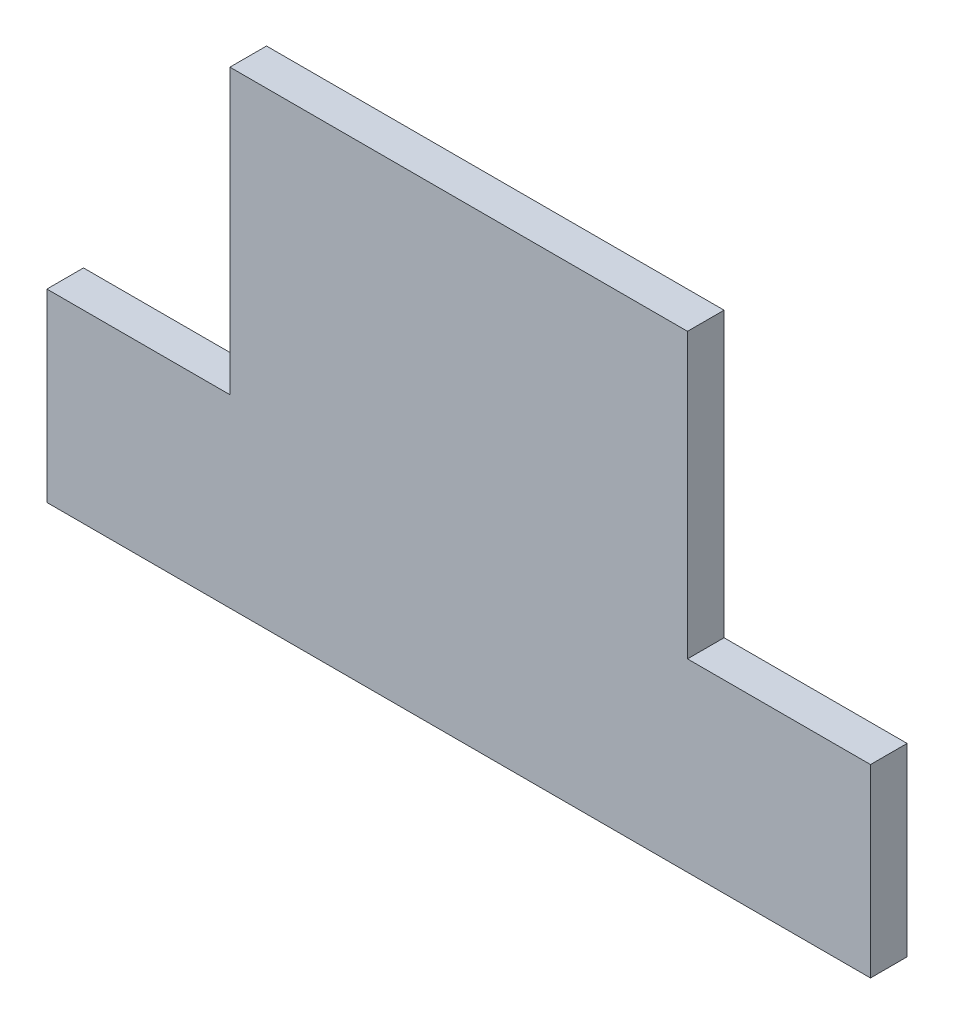
ISO-10303-21;
HEADER;
FILE_DESCRIPTION(('STEP AP214'),'2;1');
FILE_NAME('part.step','',(''),(''),'','','');
FILE_SCHEMA(('AUTOMOTIVE_DESIGN { 1 0 10303 214 1 1 1 1 }'));
ENDSEC;
DATA;
#1=APPLICATION_CONTEXT('core data for automotive mechanical design processes');
#2=APPLICATION_PROTOCOL_DEFINITION('international standard','automotive_design',2000,#1);
#3=PRODUCT_CONTEXT('',#1,'mechanical');
#4=PRODUCT('Part','Part','',(#3));
#5=PRODUCT_RELATED_PRODUCT_CATEGORY('part','',(#4));
#6=PRODUCT_DEFINITION_FORMATION('','',#4);
#7=PRODUCT_DEFINITION_CONTEXT('part definition',#1,'design');
#8=PRODUCT_DEFINITION('design','',#6,#7);
#9=PRODUCT_DEFINITION_SHAPE('','',#8);
#10=(LENGTH_UNIT() NAMED_UNIT(*) SI_UNIT(.MILLI.,.METRE.));
#11=(NAMED_UNIT(*) PLANE_ANGLE_UNIT() SI_UNIT($,.RADIAN.));
#12=(NAMED_UNIT(*) SI_UNIT($,.STERADIAN.) SOLID_ANGLE_UNIT());
#13=UNCERTAINTY_MEASURE_WITH_UNIT(LENGTH_MEASURE(1.E-05),#10,'distance_accuracy_value','');
#14=(GEOMETRIC_REPRESENTATION_CONTEXT(3) GLOBAL_UNCERTAINTY_ASSIGNED_CONTEXT((#13)) GLOBAL_UNIT_ASSIGNED_CONTEXT((#10,
#11,#12)) REPRESENTATION_CONTEXT('',''));
#15=CARTESIAN_POINT('',(0.,0.,0.));
#16=DIRECTION('',(0.,0.,1.));
#17=DIRECTION('',(1.,0.,0.));
#18=AXIS2_PLACEMENT_3D('',#15,#16,#17);
#19=CARTESIAN_POINT('',(-21.4851108434906,0.,2.));
#20=DIRECTION('',(-1.,0.,0.));
#21=DIRECTION('',(0.,-1.,0.));
#22=AXIS2_PLACEMENT_3D('',#19,#20,#21);
#23=PLANE('',#22);
#24=DIRECTION('',(0.,1.,0.));
#25=VECTOR('',#24,1.);
#26=CARTESIAN_POINT('',(-21.4851108434906,0.,0.));
#27=LINE('',#26,#25);
#28=CARTESIAN_POINT('',(-21.4851108434906,-16.7,0.));
#29=VERTEX_POINT('',#28);
#30=CARTESIAN_POINT('',(-21.4851108434906,-6.59999999999996,0.));
#31=VERTEX_POINT('',#30);
#32=EDGE_CURVE('E128',#29,#31,#27,.T.);
#33=ORIENTED_EDGE('',*,*,#32,.F.);
#34=DIRECTION('',(0.,0.,-1.));
#35=VECTOR('',#34,1.);
#36=CARTESIAN_POINT('',(-21.4851108434906,-16.7,2.));
#37=LINE('',#36,#35);
#38=CARTESIAN_POINT('',(-21.4851108434906,-16.7,2.));
#39=VERTEX_POINT('',#38);
#40=EDGE_CURVE('E11',#39,#29,#37,.T.);
#41=ORIENTED_EDGE('',*,*,#40,.F.);
#42=DIRECTION('',(0.,1.,0.));
#43=VECTOR('',#42,1.);
#44=CARTESIAN_POINT('',(-21.4851108434906,0.,2.));
#45=LINE('',#44,#43);
#46=CARTESIAN_POINT('',(-21.4851108434906,-6.59999999999996,2.));
#47=VERTEX_POINT('',#46);
#48=EDGE_CURVE('E169',#39,#47,#45,.T.);
#49=ORIENTED_EDGE('',*,*,#48,.T.);
#50=DIRECTION('',(0.,0.,-1.));
#51=VECTOR('',#50,1.);
#52=CARTESIAN_POINT('',(-21.4851108434906,-6.59999999999996,2.));
#53=LINE('',#52,#51);
#54=EDGE_CURVE('E86',#47,#31,#53,.T.);
#55=ORIENTED_EDGE('',*,*,#54,.T.);
#56=EDGE_LOOP('',(#33,#41,#49,#55));
#57=FACE_BOUND('',#56,.T.);
#58=ADVANCED_FACE('F36',(#57),#23,.T.);
#59=CARTESIAN_POINT('',(0.,-16.7,2.));
#60=DIRECTION('',(0.,-1.,0.));
#61=DIRECTION('',(1.,0.,0.));
#62=AXIS2_PLACEMENT_3D('',#59,#60,#61);
#63=PLANE('',#62);
#64=DIRECTION('',(-1.,0.,0.));
#65=VECTOR('',#64,1.);
#66=CARTESIAN_POINT('',(0.,-16.7,0.));
#67=LINE('',#66,#65);
#68=CARTESIAN_POINT('',(23.5148891565094,-16.7,0.));
#69=VERTEX_POINT('',#68);
#70=EDGE_CURVE('E131',#69,#29,#67,.T.);
#71=ORIENTED_EDGE('',*,*,#70,.F.);
#72=DIRECTION('',(0.,0.,-1.));
#73=VECTOR('',#72,1.);
#74=CARTESIAN_POINT('',(23.5148891565094,-16.7,2.));
#75=LINE('',#74,#73);
#76=CARTESIAN_POINT('',(23.5148891565094,-16.7,2.));
#77=VERTEX_POINT('',#76);
#78=EDGE_CURVE('E44',#77,#69,#75,.T.);
#79=ORIENTED_EDGE('',*,*,#78,.F.);
#80=DIRECTION('',(-1.,0.,0.));
#81=VECTOR('',#80,1.);
#82=CARTESIAN_POINT('',(0.,-16.7,2.));
#83=LINE('',#82,#81);
#84=EDGE_CURVE('E166',#77,#39,#83,.T.);
#85=ORIENTED_EDGE('',*,*,#84,.T.);
#86=ORIENTED_EDGE('',*,*,#40,.T.);
#87=EDGE_LOOP('',(#71,#79,#85,#86));
#88=FACE_BOUND('',#87,.T.);
#89=ADVANCED_FACE('F165',(#88),#63,.T.);
#90=CARTESIAN_POINT('',(23.5148891565094,0.,2.));
#91=DIRECTION('',(-1.,0.,0.));
#92=DIRECTION('',(0.,-1.,0.));
#93=AXIS2_PLACEMENT_3D('',#90,#91,#92);
#94=PLANE('',#93);
#95=DIRECTION('',(0.,1.,0.));
#96=VECTOR('',#95,1.);
#97=CARTESIAN_POINT('',(23.5148891565094,0.,0.));
#98=LINE('',#97,#96);
#99=CARTESIAN_POINT('',(23.5148891565094,-6.59999999999996,0.));
#100=VERTEX_POINT('',#99);
#101=EDGE_CURVE('E134',#69,#100,#98,.T.);
#102=ORIENTED_EDGE('',*,*,#101,.T.);
#103=DIRECTION('',(0.,0.,-1.));
#104=VECTOR('',#103,1.);
#105=CARTESIAN_POINT('',(23.5148891565094,-6.59999999999996,2.));
#106=LINE('',#105,#104);
#107=CARTESIAN_POINT('',(23.5148891565094,-6.59999999999996,2.));
#108=VERTEX_POINT('',#107);
#109=EDGE_CURVE('E150',#108,#100,#106,.T.);
#110=ORIENTED_EDGE('',*,*,#109,.F.);
#111=DIRECTION('',(0.,1.,0.));
#112=VECTOR('',#111,1.);
#113=CARTESIAN_POINT('',(23.5148891565094,0.,2.));
#114=LINE('',#113,#112);
#115=EDGE_CURVE('E157',#77,#108,#114,.T.);
#116=ORIENTED_EDGE('',*,*,#115,.F.);
#117=ORIENTED_EDGE('',*,*,#78,.T.);
#118=EDGE_LOOP('',(#102,#110,#116,#117));
#119=FACE_BOUND('',#118,.T.);
#120=ADVANCED_FACE('F155',(#119),#94,.F.);
#121=CARTESIAN_POINT('',(0.,-6.59999999999996,2.));
#122=DIRECTION('',(0.,-1.,0.));
#123=DIRECTION('',(1.,0.,0.));
#124=AXIS2_PLACEMENT_3D('',#121,#122,#123);
#125=PLANE('',#124);
#126=DIRECTION('',(-1.,0.,0.));
#127=VECTOR('',#126,1.);
#128=CARTESIAN_POINT('',(0.,-6.59999999999996,0.));
#129=LINE('',#128,#127);
#130=CARTESIAN_POINT('',(13.5148891565094,-6.59999999999996,0.));
#131=VERTEX_POINT('',#130);
#132=EDGE_CURVE('E136',#100,#131,#129,.T.);
#133=ORIENTED_EDGE('',*,*,#132,.T.);
#134=DIRECTION('',(0.,0.,-1.));
#135=VECTOR('',#134,1.);
#136=CARTESIAN_POINT('',(13.5148891565094,-6.59999999999996,2.));
#137=LINE('',#136,#135);
#138=CARTESIAN_POINT('',(13.5148891565094,-6.59999999999996,2.));
#139=VERTEX_POINT('',#138);
#140=EDGE_CURVE('E148',#139,#131,#137,.T.);
#141=ORIENTED_EDGE('',*,*,#140,.F.);
#142=DIRECTION('',(-1.,0.,0.));
#143=VECTOR('',#142,1.);
#144=CARTESIAN_POINT('',(0.,-6.59999999999996,2.));
#145=LINE('',#144,#143);
#146=EDGE_CURVE('E124',#108,#139,#145,.T.);
#147=ORIENTED_EDGE('',*,*,#146,.F.);
#148=ORIENTED_EDGE('',*,*,#109,.T.);
#149=EDGE_LOOP('',(#133,#141,#147,#148));
#150=FACE_BOUND('',#149,.T.);
#151=ADVANCED_FACE('F176',(#150),#125,.F.);
#152=CARTESIAN_POINT('',(13.5148891565094,0.,2.));
#153=DIRECTION('',(1.,0.,0.));
#154=DIRECTION('',(0.,1.,0.));
#155=AXIS2_PLACEMENT_3D('',#152,#153,#154);
#156=PLANE('',#155);
#157=DIRECTION('',(0.,-1.,0.));
#158=VECTOR('',#157,1.);
#159=CARTESIAN_POINT('',(13.5148891565094,0.,0.));
#160=LINE('',#159,#158);
#161=CARTESIAN_POINT('',(13.5148891565094,8.90000000000004,0.));
#162=VERTEX_POINT('',#161);
#163=EDGE_CURVE('E139',#162,#131,#160,.T.);
#164=ORIENTED_EDGE('',*,*,#163,.F.);
#165=DIRECTION('',(0.,0.,-1.));
#166=VECTOR('',#165,1.);
#167=CARTESIAN_POINT('',(13.5148891565094,8.90000000000004,2.));
#168=LINE('',#167,#166);
#169=CARTESIAN_POINT('',(13.5148891565094,8.90000000000004,2.));
#170=VERTEX_POINT('',#169);
#171=EDGE_CURVE('E113',#170,#162,#168,.T.);
#172=ORIENTED_EDGE('',*,*,#171,.F.);
#173=DIRECTION('',(0.,-1.,0.));
#174=VECTOR('',#173,1.);
#175=CARTESIAN_POINT('',(13.5148891565094,0.,2.));
#176=LINE('',#175,#174);
#177=EDGE_CURVE('E122',#170,#139,#176,.T.);
#178=ORIENTED_EDGE('',*,*,#177,.T.);
#179=ORIENTED_EDGE('',*,*,#140,.T.);
#180=EDGE_LOOP('',(#164,#172,#178,#179));
#181=FACE_BOUND('',#180,.T.);
#182=ADVANCED_FACE('F179',(#181),#156,.T.);
#183=CARTESIAN_POINT('',(0.,8.90000000000001,2.));
#184=DIRECTION('',(0.,1.,0.));
#185=DIRECTION('',(-1.,0.,0.));
#186=AXIS2_PLACEMENT_3D('',#183,#184,#185);
#187=PLANE('',#186);
#188=DIRECTION('',(1.,0.,0.));
#189=VECTOR('',#188,1.);
#190=CARTESIAN_POINT('',(0.,8.90000000000001,0.));
#191=LINE('',#190,#189);
#192=CARTESIAN_POINT('',(-11.4851108434906,8.90000000000004,0.));
#193=VERTEX_POINT('',#192);
#194=EDGE_CURVE('E112',#193,#162,#191,.T.);
#195=ORIENTED_EDGE('',*,*,#194,.F.);
#196=DIRECTION('',(0.,0.,-1.));
#197=VECTOR('',#196,1.);
#198=CARTESIAN_POINT('',(-11.4851108434906,8.90000000000004,2.));
#199=LINE('',#198,#197);
#200=CARTESIAN_POINT('',(-11.4851108434906,8.90000000000004,2.));
#201=VERTEX_POINT('',#200);
#202=EDGE_CURVE('E106',#201,#193,#199,.T.);
#203=ORIENTED_EDGE('',*,*,#202,.F.);
#204=DIRECTION('',(1.,0.,0.));
#205=VECTOR('',#204,1.);
#206=CARTESIAN_POINT('',(0.,8.90000000000001,2.));
#207=LINE('',#206,#205);
#208=EDGE_CURVE('E110',#201,#170,#207,.T.);
#209=ORIENTED_EDGE('',*,*,#208,.T.);
#210=ORIENTED_EDGE('',*,*,#171,.T.);
#211=EDGE_LOOP('',(#195,#203,#209,#210));
#212=FACE_BOUND('',#211,.T.);
#213=ADVANCED_FACE('F108',(#212),#187,.T.);
#214=CARTESIAN_POINT('',(-11.4851108434906,0.,2.));
#215=DIRECTION('',(1.,0.,0.));
#216=DIRECTION('',(0.,1.,0.));
#217=AXIS2_PLACEMENT_3D('',#214,#215,#216);
#218=PLANE('',#217);
#219=DIRECTION('',(0.,-1.,0.));
#220=VECTOR('',#219,1.);
#221=CARTESIAN_POINT('',(-11.4851108434906,0.,0.));
#222=LINE('',#221,#220);
#223=CARTESIAN_POINT('',(-11.4851108434906,-6.59999999999996,0.));
#224=VERTEX_POINT('',#223);
#225=EDGE_CURVE('E79',#193,#224,#222,.T.);
#226=ORIENTED_EDGE('',*,*,#225,.T.);
#227=DIRECTION('',(0.,0.,-1.));
#228=VECTOR('',#227,1.);
#229=CARTESIAN_POINT('',(-11.4851108434906,-6.59999999999996,2.));
#230=LINE('',#229,#228);
#231=CARTESIAN_POINT('',(-11.4851108434906,-6.59999999999996,2.));
#232=VERTEX_POINT('',#231);
#233=EDGE_CURVE('E114',#232,#224,#230,.T.);
#234=ORIENTED_EDGE('',*,*,#233,.F.);
#235=DIRECTION('',(0.,-1.,0.));
#236=VECTOR('',#235,1.);
#237=CARTESIAN_POINT('',(-11.4851108434906,0.,2.));
#238=LINE('',#237,#236);
#239=EDGE_CURVE('E116',#201,#232,#238,.T.);
#240=ORIENTED_EDGE('',*,*,#239,.F.);
#241=ORIENTED_EDGE('',*,*,#202,.T.);
#242=EDGE_LOOP('',(#226,#234,#240,#241));
#243=FACE_BOUND('',#242,.T.);
#244=ADVANCED_FACE('F117',(#243),#218,.F.);
#245=EDGE_CURVE('E140',#224,#31,#129,.T.);
#246=ORIENTED_EDGE('',*,*,#245,.T.);
#247=ORIENTED_EDGE('',*,*,#54,.F.);
#248=EDGE_CURVE('E52',#232,#47,#145,.T.);
#249=ORIENTED_EDGE('',*,*,#248,.F.);
#250=ORIENTED_EDGE('',*,*,#233,.T.);
#251=EDGE_LOOP('',(#246,#247,#249,#250));
#252=FACE_BOUND('',#251,.T.);
#253=ADVANCED_FACE('F188',(#252),#125,.F.);
#254=CARTESIAN_POINT('',(0.,0.,2.));
#255=DIRECTION('',(0.,0.,1.));
#256=DIRECTION('',(1.,0.,0.));
#257=AXIS2_PLACEMENT_3D('',#254,#255,#256);
#258=PLANE('',#257);
#259=ORIENTED_EDGE('',*,*,#48,.F.);
#260=ORIENTED_EDGE('',*,*,#84,.F.);
#261=ORIENTED_EDGE('',*,*,#115,.T.);
#262=ORIENTED_EDGE('',*,*,#146,.T.);
#263=ORIENTED_EDGE('',*,*,#177,.F.);
#264=ORIENTED_EDGE('',*,*,#208,.F.);
#265=ORIENTED_EDGE('',*,*,#239,.T.);
#266=ORIENTED_EDGE('',*,*,#248,.T.);
#267=EDGE_LOOP('',(#259,#260,#261,#262,#263,#264,#265,#266));
#268=FACE_BOUND('',#267,.T.);
#269=ADVANCED_FACE('F120',(#268),#258,.T.);
#270=CARTESIAN_POINT('',(0.,0.,0.));
#271=DIRECTION('',(0.,0.,1.));
#272=DIRECTION('',(1.,0.,0.));
#273=AXIS2_PLACEMENT_3D('',#270,#271,#272);
#274=PLANE('',#273);
#275=ORIENTED_EDGE('',*,*,#32,.T.);
#276=ORIENTED_EDGE('',*,*,#245,.F.);
#277=ORIENTED_EDGE('',*,*,#225,.F.);
#278=ORIENTED_EDGE('',*,*,#194,.T.);
#279=ORIENTED_EDGE('',*,*,#163,.T.);
#280=ORIENTED_EDGE('',*,*,#132,.F.);
#281=ORIENTED_EDGE('',*,*,#101,.F.);
#282=ORIENTED_EDGE('',*,*,#70,.T.);
#283=EDGE_LOOP('',(#275,#276,#277,#278,#279,#280,#281,#282));
#284=FACE_BOUND('',#283,.T.);
#285=ADVANCED_FACE('F164',(#284),#274,.F.);
#286=CLOSED_SHELL('',(#58,#89,#120,#151,#182,#213,#244,#253,#269,#285));
#287=MANIFOLD_SOLID_BREP('B2',#286);
#288=ADVANCED_BREP_SHAPE_REPRESENTATION('',(#18,#287),#14);
#289=SHAPE_DEFINITION_REPRESENTATION(#9,#288);
ENDSEC;
END-ISO-10303-21;
